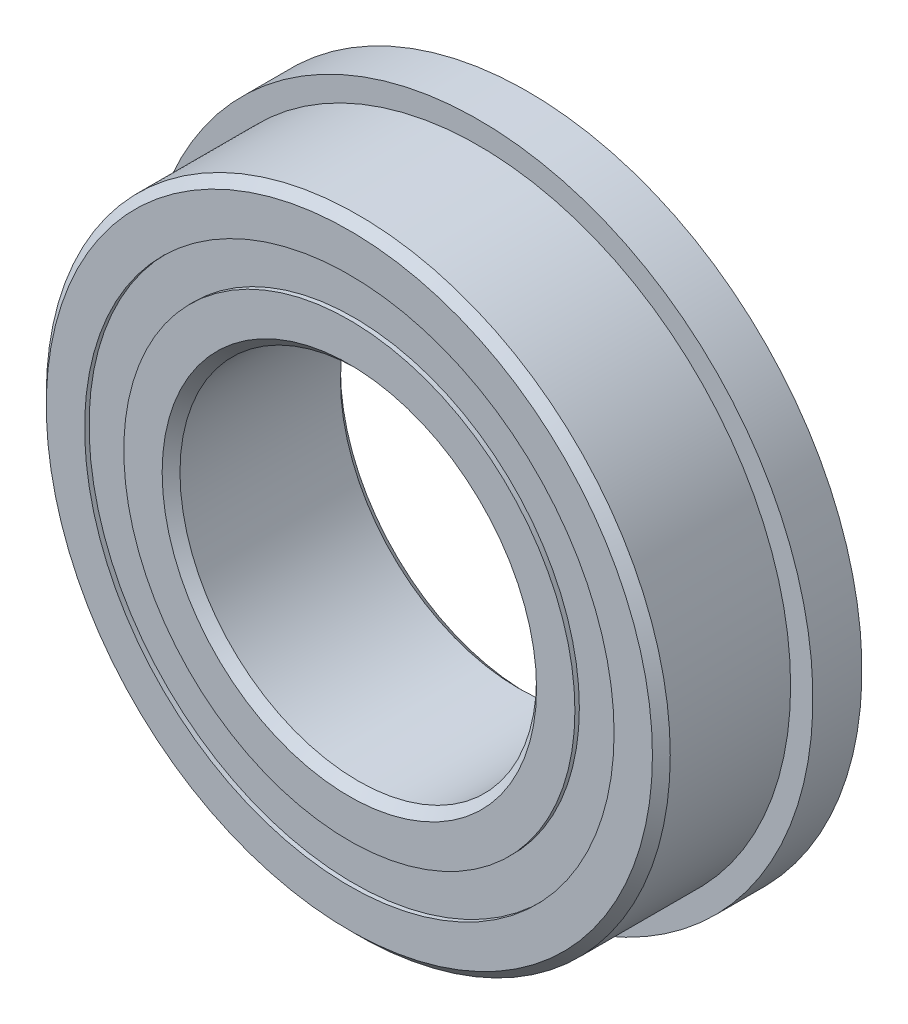
ISO-10303-21;
HEADER;
FILE_DESCRIPTION(('STEP AP214'),'2;1');
FILE_NAME('part.step','',(''),(''),'','','');
FILE_SCHEMA(('AUTOMOTIVE_DESIGN { 1 0 10303 214 1 1 1 1 }'));
ENDSEC;
DATA;
#1=APPLICATION_CONTEXT('core data for automotive mechanical design processes');
#2=APPLICATION_PROTOCOL_DEFINITION('international standard','automotive_design',2000,#1);
#3=PRODUCT_CONTEXT('',#1,'mechanical');
#4=PRODUCT('Part','Part','',(#3));
#5=PRODUCT_RELATED_PRODUCT_CATEGORY('part','',(#4));
#6=PRODUCT_DEFINITION_FORMATION('','',#4);
#7=PRODUCT_DEFINITION_CONTEXT('part definition',#1,'design');
#8=PRODUCT_DEFINITION('design','',#6,#7);
#9=PRODUCT_DEFINITION_SHAPE('','',#8);
#10=(LENGTH_UNIT() NAMED_UNIT(*) SI_UNIT(.MILLI.,.METRE.));
#11=(NAMED_UNIT(*) PLANE_ANGLE_UNIT() SI_UNIT($,.RADIAN.));
#12=(NAMED_UNIT(*) SI_UNIT($,.STERADIAN.) SOLID_ANGLE_UNIT());
#13=UNCERTAINTY_MEASURE_WITH_UNIT(LENGTH_MEASURE(1.E-05),#10,'distance_accuracy_value','');
#14=(GEOMETRIC_REPRESENTATION_CONTEXT(3) GLOBAL_UNCERTAINTY_ASSIGNED_CONTEXT((#13)) GLOBAL_UNIT_ASSIGNED_CONTEXT((#10,
#11,#12)) REPRESENTATION_CONTEXT('',''));
#15=CARTESIAN_POINT('',(0.,0.,0.));
#16=DIRECTION('',(0.,0.,1.));
#17=DIRECTION('',(1.,0.,0.));
#18=AXIS2_PLACEMENT_3D('',#15,#16,#17);
#19=CARTESIAN_POINT('',(0.,5.93956043956044,-1.9));
#20=DIRECTION('',(0.,0.,1.));
#21=DIRECTION('',(1.,0.,0.));
#22=AXIS2_PLACEMENT_3D('',#19,#20,#21);
#23=PLANE('',#22);
#24=CARTESIAN_POINT('',(0.,0.,-1.9));
#25=DIRECTION('',(0.,0.,1.));
#26=DIRECTION('',(1.,0.,0.));
#27=AXIS2_PLACEMENT_3D('',#24,#25,#26);
#28=CIRCLE('',#27,5.93956043956044);
#29=CARTESIAN_POINT('',(5.93956043956044,0.,-1.9));
#30=VERTEX_POINT('',#29);
#31=EDGE_CURVE('E56',#30,#30,#28,.T.);
#32=ORIENTED_EDGE('',*,*,#31,.F.);
#33=EDGE_LOOP('',(#32));
#34=FACE_BOUND('',#33,.T.);
#35=CARTESIAN_POINT('',(0.,0.,-1.9));
#36=DIRECTION('',(0.,0.,1.));
#37=DIRECTION('',(1.,0.,0.));
#38=AXIS2_PLACEMENT_3D('',#35,#36,#37);
#39=CIRCLE('',#38,5.06043956043956);
#40=CARTESIAN_POINT('',(5.06043956043956,0.,-1.9));
#41=VERTEX_POINT('',#40);
#42=EDGE_CURVE('E11',#41,#41,#39,.T.);
#43=ORIENTED_EDGE('',*,*,#42,.T.);
#44=EDGE_LOOP('',(#43));
#45=FACE_BOUND('',#44,.T.);
#46=ADVANCED_FACE('F42',(#34,#45),#23,.F.);
#47=CARTESIAN_POINT('',(0.,0.,2.));
#48=DIRECTION('',(0.,0.,1.));
#49=DIRECTION('',(1.,0.,0.));
#50=AXIS2_PLACEMENT_3D('',#47,#48,#49);
#51=CYLINDRICAL_SURFACE('',#50,5.06043956043956);
#52=ORIENTED_EDGE('',*,*,#42,.F.);
#53=EDGE_LOOP('',(#52));
#54=FACE_BOUND('',#53,.T.);
#55=CARTESIAN_POINT('',(0.,0.,-0.991633418565898));
#56=DIRECTION('',(0.,0.,1.));
#57=DIRECTION('',(1.,0.,0.));
#58=AXIS2_PLACEMENT_3D('',#55,#56,#57);
#59=CIRCLE('',#58,5.06043956043956);
#60=CARTESIAN_POINT('',(5.06043956043956,0.,-0.991633418565898));
#61=VERTEX_POINT('',#60);
#62=EDGE_CURVE('E48',#61,#61,#59,.T.);
#63=ORIENTED_EDGE('',*,*,#62,.T.);
#64=EDGE_LOOP('',(#63));
#65=FACE_BOUND('',#64,.T.);
#66=ADVANCED_FACE('F65',(#54,#65),#51,.F.);
#67=CARTESIAN_POINT('',(0.,5.93956043956044,-0.991633418565898));
#68=DIRECTION('',(0.,0.,-1.));
#69=DIRECTION('',(-1.,0.,0.));
#70=AXIS2_PLACEMENT_3D('',#67,#68,#69);
#71=PLANE('',#70);
#72=ORIENTED_EDGE('',*,*,#62,.F.);
#73=EDGE_LOOP('',(#72));
#74=FACE_BOUND('',#73,.T.);
#75=CARTESIAN_POINT('',(0.,0.,-0.991633418565898));
#76=DIRECTION('',(0.,0.,1.));
#77=DIRECTION('',(1.,0.,0.));
#78=AXIS2_PLACEMENT_3D('',#75,#76,#77);
#79=CIRCLE('',#78,5.93956043956044);
#80=CARTESIAN_POINT('',(5.93956043956044,0.,-0.991633418565898));
#81=VERTEX_POINT('',#80);
#82=EDGE_CURVE('E52',#81,#81,#79,.T.);
#83=ORIENTED_EDGE('',*,*,#82,.T.);
#84=EDGE_LOOP('',(#83));
#85=FACE_BOUND('',#84,.T.);
#86=ADVANCED_FACE('F69',(#74,#85),#71,.F.);
#87=CARTESIAN_POINT('',(0.,0.,2.));
#88=DIRECTION('',(0.,0.,1.));
#89=DIRECTION('',(1.,0.,0.));
#90=AXIS2_PLACEMENT_3D('',#87,#88,#89);
#91=CYLINDRICAL_SURFACE('',#90,5.93956043956044);
#92=ORIENTED_EDGE('',*,*,#82,.F.);
#93=EDGE_LOOP('',(#92));
#94=FACE_BOUND('',#93,.T.);
#95=ORIENTED_EDGE('',*,*,#31,.T.);
#96=EDGE_LOOP('',(#95));
#97=FACE_BOUND('',#96,.T.);
#98=ADVANCED_FACE('F62',(#94,#97),#91,.T.);
#99=CLOSED_SHELL('',(#46,#66,#86,#98));
#100=MANIFOLD_SOLID_BREP('B2',#99);
#101=CARTESIAN_POINT('',(0.,5.93956043956044,1.9));
#102=DIRECTION('',(0.,0.,-1.));
#103=DIRECTION('',(-1.,0.,0.));
#104=AXIS2_PLACEMENT_3D('',#101,#102,#103);
#105=PLANE('',#104);
#106=CARTESIAN_POINT('',(0.,0.,1.9));
#107=DIRECTION('',(0.,0.,1.));
#108=DIRECTION('',(1.,0.,0.));
#109=AXIS2_PLACEMENT_3D('',#106,#107,#108);
#110=CIRCLE('',#109,5.06043956043956);
#111=CARTESIAN_POINT('',(5.06043956043956,0.,1.9));
#112=VERTEX_POINT('',#111);
#113=EDGE_CURVE('E41',#112,#112,#110,.T.);
#114=ORIENTED_EDGE('',*,*,#113,.F.);
#115=EDGE_LOOP('',(#114));
#116=FACE_BOUND('',#115,.T.);
#117=CARTESIAN_POINT('',(0.,0.,1.9));
#118=DIRECTION('',(0.,0.,1.));
#119=DIRECTION('',(1.,0.,0.));
#120=AXIS2_PLACEMENT_3D('',#117,#118,#119);
#121=CIRCLE('',#120,5.93956043956044);
#122=CARTESIAN_POINT('',(5.93956043956044,0.,1.9));
#123=VERTEX_POINT('',#122);
#124=EDGE_CURVE('E124',#123,#123,#121,.T.);
#125=ORIENTED_EDGE('',*,*,#124,.T.);
#126=EDGE_LOOP('',(#125));
#127=FACE_BOUND('',#126,.T.);
#128=ADVANCED_FACE('F110',(#116,#127),#105,.F.);
#129=CARTESIAN_POINT('',(0.,0.,2.));
#130=DIRECTION('',(0.,0.,1.));
#131=DIRECTION('',(1.,0.,0.));
#132=AXIS2_PLACEMENT_3D('',#129,#130,#131);
#133=CYLINDRICAL_SURFACE('',#132,5.06043956043956);
#134=CARTESIAN_POINT('',(0.,0.,0.991633418565898));
#135=DIRECTION('',(0.,0.,1.));
#136=DIRECTION('',(1.,0.,0.));
#137=AXIS2_PLACEMENT_3D('',#134,#135,#136);
#138=CIRCLE('',#137,5.06043956043956);
#139=CARTESIAN_POINT('',(5.06043956043956,0.,0.991633418565898));
#140=VERTEX_POINT('',#139);
#141=EDGE_CURVE('E116',#140,#140,#138,.T.);
#142=ORIENTED_EDGE('',*,*,#141,.F.);
#143=EDGE_LOOP('',(#142));
#144=FACE_BOUND('',#143,.T.);
#145=ORIENTED_EDGE('',*,*,#113,.T.);
#146=EDGE_LOOP('',(#145));
#147=FACE_BOUND('',#146,.T.);
#148=ADVANCED_FACE('F139',(#144,#147),#133,.F.);
#149=CARTESIAN_POINT('',(0.,5.93956043956044,0.991633418565898));
#150=DIRECTION('',(0.,0.,1.));
#151=DIRECTION('',(1.,0.,0.));
#152=AXIS2_PLACEMENT_3D('',#149,#150,#151);
#153=PLANE('',#152);
#154=CARTESIAN_POINT('',(0.,0.,0.991633418565898));
#155=DIRECTION('',(0.,0.,1.));
#156=DIRECTION('',(1.,0.,0.));
#157=AXIS2_PLACEMENT_3D('',#154,#155,#156);
#158=CIRCLE('',#157,5.93956043956044);
#159=CARTESIAN_POINT('',(5.93956043956044,0.,0.991633418565898));
#160=VERTEX_POINT('',#159);
#161=EDGE_CURVE('E120',#160,#160,#158,.T.);
#162=ORIENTED_EDGE('',*,*,#161,.F.);
#163=EDGE_LOOP('',(#162));
#164=FACE_BOUND('',#163,.T.);
#165=ORIENTED_EDGE('',*,*,#141,.T.);
#166=EDGE_LOOP('',(#165));
#167=FACE_BOUND('',#166,.T.);
#168=ADVANCED_FACE('F134',(#164,#167),#153,.F.);
#169=CARTESIAN_POINT('',(0.,0.,2.));
#170=DIRECTION('',(0.,0.,1.));
#171=DIRECTION('',(1.,0.,0.));
#172=AXIS2_PLACEMENT_3D('',#169,#170,#171);
#173=CYLINDRICAL_SURFACE('',#172,5.93956043956044);
#174=ORIENTED_EDGE('',*,*,#124,.F.);
#175=EDGE_LOOP('',(#174));
#176=FACE_BOUND('',#175,.T.);
#177=ORIENTED_EDGE('',*,*,#161,.T.);
#178=EDGE_LOOP('',(#177));
#179=FACE_BOUND('',#178,.T.);
#180=ADVANCED_FACE('F131',(#176,#179),#173,.T.);
#181=CLOSED_SHELL('',(#128,#148,#168,#180));
#182=MANIFOLD_SOLID_BREP('B6',#181);
#183=CARTESIAN_POINT('',(-2.74999999999994,4.76313972081445,0.));
#184=DIRECTION('',(0.,0.,1.));
#185=DIRECTION('',(-0.499999999999989,0.866025403784445,0.));
#186=AXIS2_PLACEMENT_3D('',#183,#184,#185);
#187=SPHERICAL_SURFACE('',#186,0.991633418565898);
#188=CARTESIAN_POINT('',(-2.74999999999994,4.76313972081445,0.991633418565898));
#189=VERTEX_POINT('',#188);
#190=VERTEX_LOOP('',#189);
#191=FACE_BOUND('',#190,.T.);
#192=ADVANCED_FACE('F178',(#191),#187,.T.);
#193=CLOSED_SHELL('',(#192));
#194=MANIFOLD_SOLID_BREP('B36_NOT_SHOWN',#193);
#195=CARTESIAN_POINT('',(-4.76313972081438,2.75000000000006,0.));
#196=DIRECTION('',(0.,0.,1.));
#197=DIRECTION('',(-0.866025403784433,0.50000000000001,0.));
#198=AXIS2_PLACEMENT_3D('',#195,#196,#197);
#199=SPHERICAL_SURFACE('',#198,0.991633418565898);
#200=CARTESIAN_POINT('',(-4.76313972081438,2.75000000000006,0.991633418565898));
#201=VERTEX_POINT('',#200);
#202=VERTEX_LOOP('',#201);
#203=FACE_BOUND('',#202,.T.);
#204=ADVANCED_FACE('F209',(#203),#199,.T.);
#205=CLOSED_SHELL('',(#204));
#206=MANIFOLD_SOLID_BREP('B106_NOT_SHOWN',#205);
#207=CARTESIAN_POINT('',(-5.5,0.,0.));
#208=DIRECTION('',(0.,0.,1.));
#209=DIRECTION('',(-1.,0.,0.));
#210=AXIS2_PLACEMENT_3D('',#207,#208,#209);
#211=SPHERICAL_SURFACE('',#210,0.991633418565898);
#212=CARTESIAN_POINT('',(-5.5,0.,0.991633418565898));
#213=VERTEX_POINT('',#212);
#214=VERTEX_LOOP('',#213);
#215=FACE_BOUND('',#214,.T.);
#216=ADVANCED_FACE('F240',(#215),#211,.T.);
#217=CLOSED_SHELL('',(#216));
#218=MANIFOLD_SOLID_BREP('B174_NOT_SHOWN',#217);
#219=CARTESIAN_POINT('',(-4.76313972081444,-2.74999999999996,0.));
#220=DIRECTION('',(0.,0.,1.));
#221=DIRECTION('',(-0.866025403784443,-0.499999999999992,0.));
#222=AXIS2_PLACEMENT_3D('',#219,#220,#221);
#223=SPHERICAL_SURFACE('',#222,0.991633418565898);
#224=CARTESIAN_POINT('',(-4.76313972081444,-2.74999999999996,0.991633418565898));
#225=VERTEX_POINT('',#224);
#226=VERTEX_LOOP('',#225);
#227=FACE_BOUND('',#226,.T.);
#228=ADVANCED_FACE('F271',(#227),#223,.T.);
#229=CLOSED_SHELL('',(#228));
#230=MANIFOLD_SOLID_BREP('B205_NOT_SHOWN',#229);
#231=CARTESIAN_POINT('',(-2.75000000000004,-4.76313972081439,0.));
#232=DIRECTION('',(0.,0.,1.));
#233=DIRECTION('',(-0.500000000000007,-0.866025403784435,0.));
#234=AXIS2_PLACEMENT_3D('',#231,#232,#233);
#235=SPHERICAL_SURFACE('',#234,0.991633418565898);
#236=CARTESIAN_POINT('',(-2.75000000000004,-4.76313972081439,0.991633418565898));
#237=VERTEX_POINT('',#236);
#238=VERTEX_LOOP('',#237);
#239=FACE_BOUND('',#238,.T.);
#240=ADVANCED_FACE('F302',(#239),#235,.T.);
#241=CLOSED_SHELL('',(#240));
#242=MANIFOLD_SOLID_BREP('B236_NOT_SHOWN',#241);
#243=CARTESIAN_POINT('',(0.,-5.5,0.));
#244=DIRECTION('',(0.,0.,1.));
#245=DIRECTION('',(0.,-1.,0.));
#246=AXIS2_PLACEMENT_3D('',#243,#244,#245);
#247=SPHERICAL_SURFACE('',#246,0.991633418565898);
#248=CARTESIAN_POINT('',(0.,-5.5,0.991633418565898));
#249=VERTEX_POINT('',#248);
#250=VERTEX_LOOP('',#249);
#251=FACE_BOUND('',#250,.T.);
#252=ADVANCED_FACE('F333',(#251),#247,.T.);
#253=CLOSED_SHELL('',(#252));
#254=MANIFOLD_SOLID_BREP('B267_NOT_SHOWN',#253);
#255=CARTESIAN_POINT('',(2.74999999999997,-4.76313972081443,0.));
#256=DIRECTION('',(0.,0.,1.));
#257=DIRECTION('',(0.499999999999995,-0.866025403784442,0.));
#258=AXIS2_PLACEMENT_3D('',#255,#256,#257);
#259=SPHERICAL_SURFACE('',#258,0.991633418565898);
#260=CARTESIAN_POINT('',(2.74999999999997,-4.76313972081443,0.991633418565898));
#261=VERTEX_POINT('',#260);
#262=VERTEX_LOOP('',#261);
#263=FACE_BOUND('',#262,.T.);
#264=ADVANCED_FACE('F364',(#263),#259,.T.);
#265=CLOSED_SHELL('',(#264));
#266=MANIFOLD_SOLID_BREP('B298_NOT_SHOWN',#265);
#267=CARTESIAN_POINT('',(4.7631397208144,-2.75000000000002,0.));
#268=DIRECTION('',(0.,0.,1.));
#269=DIRECTION('',(0.866025403784436,-0.500000000000004,0.));
#270=AXIS2_PLACEMENT_3D('',#267,#268,#269);
#271=SPHERICAL_SURFACE('',#270,0.991633418565898);
#272=CARTESIAN_POINT('',(4.7631397208144,-2.75000000000002,0.991633418565898));
#273=VERTEX_POINT('',#272);
#274=VERTEX_LOOP('',#273);
#275=FACE_BOUND('',#274,.T.);
#276=ADVANCED_FACE('F395',(#275),#271,.T.);
#277=CLOSED_SHELL('',(#276));
#278=MANIFOLD_SOLID_BREP('B329_NOT_SHOWN',#277);
#279=CARTESIAN_POINT('',(5.5,0.,0.));
#280=DIRECTION('',(0.,0.,1.));
#281=DIRECTION('',(1.,0.,0.));
#282=AXIS2_PLACEMENT_3D('',#279,#280,#281);
#283=SPHERICAL_SURFACE('',#282,0.991633418565898);
#284=CARTESIAN_POINT('',(5.5,0.,0.991633418565898));
#285=VERTEX_POINT('',#284);
#286=VERTEX_LOOP('',#285);
#287=FACE_BOUND('',#286,.T.);
#288=ADVANCED_FACE('F426',(#287),#283,.T.);
#289=CLOSED_SHELL('',(#288));
#290=MANIFOLD_SOLID_BREP('B360_NOT_SHOWN',#289);
#291=CARTESIAN_POINT('',(4.76313972081442,2.74999999999999,0.));
#292=DIRECTION('',(0.,0.,1.));
#293=DIRECTION('',(0.86602540378444,0.499999999999998,0.));
#294=AXIS2_PLACEMENT_3D('',#291,#292,#293);
#295=SPHERICAL_SURFACE('',#294,0.991633418565898);
#296=CARTESIAN_POINT('',(4.76313972081442,2.74999999999999,0.991633418565898));
#297=VERTEX_POINT('',#296);
#298=VERTEX_LOOP('',#297);
#299=FACE_BOUND('',#298,.T.);
#300=ADVANCED_FACE('F457',(#299),#295,.T.);
#301=CLOSED_SHELL('',(#300));
#302=MANIFOLD_SOLID_BREP('B391_NOT_SHOWN',#301);
#303=CARTESIAN_POINT('',(2.75000000000001,4.76313972081441,0.));
#304=DIRECTION('',(0.,0.,1.));
#305=DIRECTION('',(0.500000000000001,0.866025403784438,0.));
#306=AXIS2_PLACEMENT_3D('',#303,#304,#305);
#307=SPHERICAL_SURFACE('',#306,0.991633418565898);
#308=CARTESIAN_POINT('',(2.75000000000001,4.76313972081441,0.991633418565898));
#309=VERTEX_POINT('',#308);
#310=VERTEX_LOOP('',#309);
#311=FACE_BOUND('',#310,.T.);
#312=ADVANCED_FACE('F488',(#311),#307,.T.);
#313=CLOSED_SHELL('',(#312));
#314=MANIFOLD_SOLID_BREP('B422_NOT_SHOWN',#313);
#315=CARTESIAN_POINT('',(0.,5.5,0.));
#316=DIRECTION('',(0.,0.,1.));
#317=DIRECTION('',(0.,1.,0.));
#318=AXIS2_PLACEMENT_3D('',#315,#316,#317);
#319=SPHERICAL_SURFACE('',#318,0.991633418565898);
#320=CARTESIAN_POINT('',(0.,5.5,0.991633418565898));
#321=VERTEX_POINT('',#320);
#322=VERTEX_LOOP('',#321);
#323=FACE_BOUND('',#322,.T.);
#324=ADVANCED_FACE('F521',(#323),#319,.T.);
#325=CLOSED_SHELL('',(#324));
#326=MANIFOLD_SOLID_BREP('B453',#325);
#327=CARTESIAN_POINT('',(0.,5.06043956043956,2.));
#328=DIRECTION('',(0.,0.,-1.));
#329=DIRECTION('',(-1.,0.,0.));
#330=AXIS2_PLACEMENT_3D('',#327,#328,#329);
#331=PLANE('',#330);
#332=CARTESIAN_POINT('',(0.,0.,2.));
#333=DIRECTION('',(0.,0.,1.));
#334=DIRECTION('',(1.,0.,0.));
#335=AXIS2_PLACEMENT_3D('',#332,#333,#334);
#336=CIRCLE('',#335,4.2);
#337=CARTESIAN_POINT('',(4.2,0.,2.));
#338=VERTEX_POINT('',#337);
#339=EDGE_CURVE('E569',#338,#338,#336,.T.);
#340=ORIENTED_EDGE('',*,*,#339,.F.);
#341=EDGE_LOOP('',(#340));
#342=FACE_BOUND('',#341,.T.);
#343=CARTESIAN_POINT('',(0.,0.,2.));
#344=DIRECTION('',(0.,0.,1.));
#345=DIRECTION('',(1.,0.,0.));
#346=AXIS2_PLACEMENT_3D('',#343,#344,#345);
#347=CIRCLE('',#346,5.06043956043956);
#348=CARTESIAN_POINT('',(5.06043956043956,0.,2.));
#349=VERTEX_POINT('',#348);
#350=EDGE_CURVE('E520',#349,#349,#347,.T.);
#351=ORIENTED_EDGE('',*,*,#350,.T.);
#352=EDGE_LOOP('',(#351));
#353=FACE_BOUND('',#352,.T.);
#354=ADVANCED_FACE('F541',(#342,#353),#331,.F.);
#355=CARTESIAN_POINT('',(0.,0.,2.));
#356=DIRECTION('',(0.,0.,1.));
#357=DIRECTION('',(1.,0.,0.));
#358=AXIS2_PLACEMENT_3D('',#355,#356,#357);
#359=CYLINDRICAL_SURFACE('',#358,5.06043956043956);
#360=ORIENTED_EDGE('',*,*,#350,.F.);
#361=EDGE_LOOP('',(#360));
#362=FACE_BOUND('',#361,.T.);
#363=CARTESIAN_POINT('',(0.,0.,0.888888888888889));
#364=DIRECTION('',(0.,0.,1.));
#365=DIRECTION('',(1.,0.,0.));
#366=AXIS2_PLACEMENT_3D('',#363,#364,#365);
#367=CIRCLE('',#366,5.06043956043956);
#368=CARTESIAN_POINT('',(5.06043956043956,0.,0.888888888888889));
#369=VERTEX_POINT('',#368);
#370=EDGE_CURVE('E547',#369,#369,#367,.T.);
#371=ORIENTED_EDGE('',*,*,#370,.T.);
#372=EDGE_LOOP('',(#371));
#373=FACE_BOUND('',#372,.T.);
#374=ADVANCED_FACE('F576',(#362,#373),#359,.T.);
#375=CARTESIAN_POINT('',(0.,0.,0.));
#376=DIRECTION('',(0.,0.,1.));
#377=DIRECTION('',(1.,0.,0.));
#378=AXIS2_PLACEMENT_3D('',#375,#376,#377);
#379=TOROIDAL_SURFACE('',#378,5.5,0.991633418565896);
#380=ORIENTED_EDGE('',*,*,#370,.F.);
#381=EDGE_LOOP('',(#380));
#382=FACE_BOUND('',#381,.T.);
#383=CARTESIAN_POINT('',(0.,0.,-0.88888888888889));
#384=DIRECTION('',(0.,0.,1.));
#385=DIRECTION('',(1.,0.,0.));
#386=AXIS2_PLACEMENT_3D('',#383,#384,#385);
#387=CIRCLE('',#386,5.06043956043956);
#388=CARTESIAN_POINT('',(5.06043956043956,0.,-0.88888888888889));
#389=VERTEX_POINT('',#388);
#390=EDGE_CURVE('E551',#389,#389,#387,.T.);
#391=ORIENTED_EDGE('',*,*,#390,.T.);
#392=EDGE_LOOP('',(#391));
#393=FACE_BOUND('',#392,.T.);
#394=ADVANCED_FACE('F580',(#382,#393),#379,.F.);
#395=CARTESIAN_POINT('',(0.,0.,2.));
#396=DIRECTION('',(0.,0.,1.));
#397=DIRECTION('',(1.,0.,0.));
#398=AXIS2_PLACEMENT_3D('',#395,#396,#397);
#399=CYLINDRICAL_SURFACE('',#398,5.06043956043956);
#400=ORIENTED_EDGE('',*,*,#390,.F.);
#401=EDGE_LOOP('',(#400));
#402=FACE_BOUND('',#401,.T.);
#403=CARTESIAN_POINT('',(0.,0.,-2.));
#404=DIRECTION('',(0.,0.,1.));
#405=DIRECTION('',(1.,0.,0.));
#406=AXIS2_PLACEMENT_3D('',#403,#404,#405);
#407=CIRCLE('',#406,5.06043956043956);
#408=CARTESIAN_POINT('',(5.06043956043956,0.,-2.));
#409=VERTEX_POINT('',#408);
#410=EDGE_CURVE('E555',#409,#409,#407,.T.);
#411=ORIENTED_EDGE('',*,*,#410,.T.);
#412=EDGE_LOOP('',(#411));
#413=FACE_BOUND('',#412,.T.);
#414=ADVANCED_FACE('F585',(#402,#413),#399,.T.);
#415=CARTESIAN_POINT('',(0.,4.2,-2.));
#416=DIRECTION('',(0.,0.,1.));
#417=DIRECTION('',(1.,0.,0.));
#418=AXIS2_PLACEMENT_3D('',#415,#416,#417);
#419=PLANE('',#418);
#420=ORIENTED_EDGE('',*,*,#410,.F.);
#421=EDGE_LOOP('',(#420));
#422=FACE_BOUND('',#421,.T.);
#423=CARTESIAN_POINT('',(0.,0.,-2.));
#424=DIRECTION('',(0.,0.,1.));
#425=DIRECTION('',(1.,0.,0.));
#426=AXIS2_PLACEMENT_3D('',#423,#424,#425);
#427=CIRCLE('',#426,4.2);
#428=CARTESIAN_POINT('',(4.2,0.,-2.));
#429=VERTEX_POINT('',#428);
#430=EDGE_CURVE('E560',#429,#429,#427,.T.);
#431=ORIENTED_EDGE('',*,*,#430,.T.);
#432=EDGE_LOOP('',(#431));
#433=FACE_BOUND('',#432,.T.);
#434=ADVANCED_FACE('F591',(#422,#433),#419,.F.);
#435=CARTESIAN_POINT('',(0.,0.,-1.8));
#436=DIRECTION('',(0.,0.,-1.));
#437=DIRECTION('',(-1.,0.,0.));
#438=AXIS2_PLACEMENT_3D('',#435,#436,#437);
#439=CONICAL_SURFACE('',#438,4.,0.785398163397445);
#440=ORIENTED_EDGE('',*,*,#430,.F.);
#441=EDGE_LOOP('',(#440));
#442=FACE_BOUND('',#441,.T.);
#443=CARTESIAN_POINT('',(0.,0.,-1.8));
#444=DIRECTION('',(0.,0.,1.));
#445=DIRECTION('',(1.,0.,0.));
#446=AXIS2_PLACEMENT_3D('',#443,#444,#445);
#447=CIRCLE('',#446,4.);
#448=CARTESIAN_POINT('',(4.,0.,-1.8));
#449=VERTEX_POINT('',#448);
#450=EDGE_CURVE('E563',#449,#449,#447,.T.);
#451=ORIENTED_EDGE('',*,*,#450,.T.);
#452=EDGE_LOOP('',(#451));
#453=FACE_BOUND('',#452,.T.);
#454=ADVANCED_FACE('F595',(#442,#453),#439,.F.);
#455=CARTESIAN_POINT('',(0.,0.,2.));
#456=DIRECTION('',(0.,0.,1.));
#457=DIRECTION('',(1.,0.,0.));
#458=AXIS2_PLACEMENT_3D('',#455,#456,#457);
#459=CYLINDRICAL_SURFACE('',#458,4.);
#460=ORIENTED_EDGE('',*,*,#450,.F.);
#461=EDGE_LOOP('',(#460));
#462=FACE_BOUND('',#461,.T.);
#463=CARTESIAN_POINT('',(0.,0.,1.8));
#464=DIRECTION('',(0.,0.,1.));
#465=DIRECTION('',(1.,0.,0.));
#466=AXIS2_PLACEMENT_3D('',#463,#464,#465);
#467=CIRCLE('',#466,4.);
#468=CARTESIAN_POINT('',(4.,0.,1.8));
#469=VERTEX_POINT('',#468);
#470=EDGE_CURVE('E566',#469,#469,#467,.T.);
#471=ORIENTED_EDGE('',*,*,#470,.T.);
#472=EDGE_LOOP('',(#471));
#473=FACE_BOUND('',#472,.T.);
#474=ADVANCED_FACE('F599',(#462,#473),#459,.F.);
#475=CARTESIAN_POINT('',(0.,0.,2.));
#476=DIRECTION('',(0.,0.,1.));
#477=DIRECTION('',(1.,0.,0.));
#478=AXIS2_PLACEMENT_3D('',#475,#476,#477);
#479=CONICAL_SURFACE('',#478,4.2,0.785398163397451);
#480=ORIENTED_EDGE('',*,*,#470,.F.);
#481=EDGE_LOOP('',(#480));
#482=FACE_BOUND('',#481,.T.);
#483=ORIENTED_EDGE('',*,*,#339,.T.);
#484=EDGE_LOOP('',(#483));
#485=FACE_BOUND('',#484,.T.);
#486=ADVANCED_FACE('F573',(#482,#485),#479,.F.);
#487=CLOSED_SHELL('',(#354,#374,#394,#414,#434,#454,#474,#486));
#488=MANIFOLD_SOLID_BREP('B484',#487);
#489=CARTESIAN_POINT('',(0.,0.,1.8));
#490=DIRECTION('',(0.,0.,-1.));
#491=DIRECTION('',(-1.,0.,0.));
#492=AXIS2_PLACEMENT_3D('',#489,#490,#491);
#493=CONICAL_SURFACE('',#492,7.,0.785398163397447);
#494=CARTESIAN_POINT('',(0.,0.,2.));
#495=DIRECTION('',(0.,0.,1.));
#496=DIRECTION('',(1.,0.,0.));
#497=AXIS2_PLACEMENT_3D('',#494,#495,#496);
#498=CIRCLE('',#497,6.8);
#499=CARTESIAN_POINT('',(6.8,0.,2.));
#500=VERTEX_POINT('',#499);
#501=EDGE_CURVE('E685',#500,#500,#498,.T.);
#502=ORIENTED_EDGE('',*,*,#501,.F.);
#503=EDGE_LOOP('',(#502));
#504=FACE_BOUND('',#503,.T.);
#505=CARTESIAN_POINT('',(0.,0.,1.8));
#506=DIRECTION('',(0.,0.,1.));
#507=DIRECTION('',(1.,0.,0.));
#508=AXIS2_PLACEMENT_3D('',#505,#506,#507);
#509=CIRCLE('',#508,7.);
#510=CARTESIAN_POINT('',(7.,0.,1.8));
#511=VERTEX_POINT('',#510);
#512=EDGE_CURVE('E540',#511,#511,#509,.T.);
#513=ORIENTED_EDGE('',*,*,#512,.T.);
#514=EDGE_LOOP('',(#513));
#515=FACE_BOUND('',#514,.T.);
#516=ADVANCED_FACE('F663',(#504,#515),#493,.T.);
#517=CARTESIAN_POINT('',(0.,0.,2.));
#518=DIRECTION('',(0.,0.,1.));
#519=DIRECTION('',(1.,0.,0.));
#520=AXIS2_PLACEMENT_3D('',#517,#518,#519);
#521=CYLINDRICAL_SURFACE('',#520,7.);
#522=CARTESIAN_POINT('',(0.,0.,-0.9));
#523=DIRECTION('',(0.,0.,1.));
#524=DIRECTION('',(1.,0.,0.));
#525=AXIS2_PLACEMENT_3D('',#522,#523,#524);
#526=CIRCLE('',#525,7.);
#527=CARTESIAN_POINT('',(7.,0.,-0.9));
#528=VERTEX_POINT('',#527);
#529=EDGE_CURVE('E688',#528,#528,#526,.T.);
#530=ORIENTED_EDGE('',*,*,#529,.T.);
#531=EDGE_LOOP('',(#530));
#532=FACE_BOUND('',#531,.T.);
#533=ORIENTED_EDGE('',*,*,#512,.F.);
#534=EDGE_LOOP('',(#533));
#535=FACE_BOUND('',#534,.T.);
#536=ADVANCED_FACE('F708',(#532,#535),#521,.T.);
#537=CARTESIAN_POINT('',(0.,6.8,-2.));
#538=DIRECTION('',(0.,0.,1.));
#539=DIRECTION('',(1.,0.,0.));
#540=AXIS2_PLACEMENT_3D('',#537,#538,#539);
#541=PLANE('',#540);
#542=CARTESIAN_POINT('',(0.,0.,-2.));
#543=DIRECTION('',(0.,0.,1.));
#544=DIRECTION('',(1.,0.,0.));
#545=AXIS2_PLACEMENT_3D('',#542,#543,#544);
#546=CIRCLE('',#545,5.93956043956044);
#547=CARTESIAN_POINT('',(5.93956043956044,0.,-2.));
#548=VERTEX_POINT('',#547);
#549=EDGE_CURVE('E669',#548,#548,#546,.T.);
#550=ORIENTED_EDGE('',*,*,#549,.T.);
#551=EDGE_LOOP('',(#550));
#552=FACE_BOUND('',#551,.T.);
#553=CARTESIAN_POINT('',(0.,0.,-2.));
#554=DIRECTION('',(0.,0.,-1.));
#555=DIRECTION('',(-1.,0.,0.));
#556=AXIS2_PLACEMENT_3D('',#553,#554,#555);
#557=CIRCLE('',#556,7.5);
#558=CARTESIAN_POINT('',(-7.5,0.,-2.));
#559=VERTEX_POINT('',#558);
#560=EDGE_CURVE('E691',#559,#559,#557,.T.);
#561=ORIENTED_EDGE('',*,*,#560,.T.);
#562=EDGE_LOOP('',(#561));
#563=FACE_BOUND('',#562,.T.);
#564=ADVANCED_FACE('F711',(#552,#563),#541,.F.);
#565=CARTESIAN_POINT('',(0.,0.,2.));
#566=DIRECTION('',(0.,0.,1.));
#567=DIRECTION('',(1.,0.,0.));
#568=AXIS2_PLACEMENT_3D('',#565,#566,#567);
#569=CYLINDRICAL_SURFACE('',#568,5.93956043956044);
#570=CARTESIAN_POINT('',(0.,0.,-0.888888888888889));
#571=DIRECTION('',(0.,0.,1.));
#572=DIRECTION('',(1.,0.,0.));
#573=AXIS2_PLACEMENT_3D('',#570,#571,#572);
#574=CIRCLE('',#573,5.93956043956044);
#575=CARTESIAN_POINT('',(5.93956043956044,0.,-0.888888888888889));
#576=VERTEX_POINT('',#575);
#577=EDGE_CURVE('E673',#576,#576,#574,.T.);
#578=ORIENTED_EDGE('',*,*,#577,.T.);
#579=EDGE_LOOP('',(#578));
#580=FACE_BOUND('',#579,.T.);
#581=ORIENTED_EDGE('',*,*,#549,.F.);
#582=EDGE_LOOP('',(#581));
#583=FACE_BOUND('',#582,.T.);
#584=ADVANCED_FACE('F716',(#580,#583),#569,.F.);
#585=CARTESIAN_POINT('',(0.,0.,0.));
#586=DIRECTION('',(0.,0.,1.));
#587=DIRECTION('',(1.,0.,0.));
#588=AXIS2_PLACEMENT_3D('',#585,#586,#587);
#589=TOROIDAL_SURFACE('',#588,5.5,0.991633418565898);
#590=ORIENTED_EDGE('',*,*,#577,.F.);
#591=EDGE_LOOP('',(#590));
#592=FACE_BOUND('',#591,.T.);
#593=CARTESIAN_POINT('',(0.,0.,0.888888888888889));
#594=DIRECTION('',(0.,0.,1.));
#595=DIRECTION('',(1.,0.,0.));
#596=AXIS2_PLACEMENT_3D('',#593,#594,#595);
#597=CIRCLE('',#596,5.93956043956044);
#598=CARTESIAN_POINT('',(5.93956043956044,0.,0.888888888888889));
#599=VERTEX_POINT('',#598);
#600=EDGE_CURVE('E677',#599,#599,#597,.T.);
#601=ORIENTED_EDGE('',*,*,#600,.T.);
#602=EDGE_LOOP('',(#601));
#603=FACE_BOUND('',#602,.T.);
#604=ADVANCED_FACE('F722',(#592,#603),#589,.F.);
#605=CARTESIAN_POINT('',(0.,0.,2.));
#606=DIRECTION('',(0.,0.,1.));
#607=DIRECTION('',(1.,0.,0.));
#608=AXIS2_PLACEMENT_3D('',#605,#606,#607);
#609=CYLINDRICAL_SURFACE('',#608,5.93956043956044);
#610=ORIENTED_EDGE('',*,*,#600,.F.);
#611=EDGE_LOOP('',(#610));
#612=FACE_BOUND('',#611,.T.);
#613=CARTESIAN_POINT('',(0.,0.,2.));
#614=DIRECTION('',(0.,0.,1.));
#615=DIRECTION('',(1.,0.,0.));
#616=AXIS2_PLACEMENT_3D('',#613,#614,#615);
#617=CIRCLE('',#616,5.93956043956044);
#618=CARTESIAN_POINT('',(5.93956043956044,0.,2.));
#619=VERTEX_POINT('',#618);
#620=EDGE_CURVE('E682',#619,#619,#617,.T.);
#621=ORIENTED_EDGE('',*,*,#620,.T.);
#622=EDGE_LOOP('',(#621));
#623=FACE_BOUND('',#622,.T.);
#624=ADVANCED_FACE('F726',(#612,#623),#609,.F.);
#625=CARTESIAN_POINT('',(0.,6.8,2.));
#626=DIRECTION('',(0.,0.,-1.));
#627=DIRECTION('',(-1.,0.,0.));
#628=AXIS2_PLACEMENT_3D('',#625,#626,#627);
#629=PLANE('',#628);
#630=ORIENTED_EDGE('',*,*,#620,.F.);
#631=EDGE_LOOP('',(#630));
#632=FACE_BOUND('',#631,.T.);
#633=ORIENTED_EDGE('',*,*,#501,.T.);
#634=EDGE_LOOP('',(#633));
#635=FACE_BOUND('',#634,.T.);
#636=ADVANCED_FACE('F704',(#632,#635),#629,.F.);
#637=CARTESIAN_POINT('',(0.,5.93956043956044,-0.9));
#638=DIRECTION('',(0.,0.,1.));
#639=DIRECTION('',(1.,0.,0.));
#640=AXIS2_PLACEMENT_3D('',#637,#638,#639);
#641=PLANE('',#640);
#642=CARTESIAN_POINT('',(0.,0.,-0.9));
#643=DIRECTION('',(0.,0.,-1.));
#644=DIRECTION('',(-1.,0.,0.));
#645=AXIS2_PLACEMENT_3D('',#642,#643,#644);
#646=CIRCLE('',#645,7.5);
#647=CARTESIAN_POINT('',(-7.5,0.,-0.9));
#648=VERTEX_POINT('',#647);
#649=EDGE_CURVE('E694',#648,#648,#646,.T.);
#650=ORIENTED_EDGE('',*,*,#649,.F.);
#651=EDGE_LOOP('',(#650));
#652=FACE_BOUND('',#651,.T.);
#653=ORIENTED_EDGE('',*,*,#529,.F.);
#654=EDGE_LOOP('',(#653));
#655=FACE_BOUND('',#654,.T.);
#656=ADVANCED_FACE('F701',(#652,#655),#641,.T.);
#657=CARTESIAN_POINT('',(0.,0.,-2.));
#658=DIRECTION('',(0.,0.,-1.));
#659=DIRECTION('',(-1.,0.,0.));
#660=AXIS2_PLACEMENT_3D('',#657,#658,#659);
#661=CYLINDRICAL_SURFACE('',#660,7.5);
#662=ORIENTED_EDGE('',*,*,#649,.T.);
#663=EDGE_LOOP('',(#662));
#664=FACE_BOUND('',#663,.T.);
#665=ORIENTED_EDGE('',*,*,#560,.F.);
#666=EDGE_LOOP('',(#665));
#667=FACE_BOUND('',#666,.T.);
#668=ADVANCED_FACE('F698',(#664,#667),#661,.T.);
#669=CLOSED_SHELL('',(#516,#536,#564,#584,#604,#624,#636,#656,#668));
#670=MANIFOLD_SOLID_BREP('B515',#669);
#671=ADVANCED_BREP_SHAPE_REPRESENTATION('',(#18,#100,#182,#194,#206,#218,#230,#242,#254,#266,
#278,#290,#302,#314,#326,#488,#670),#14);
#672=SHAPE_DEFINITION_REPRESENTATION(#9,#671);
ENDSEC;
END-ISO-10303-21;
